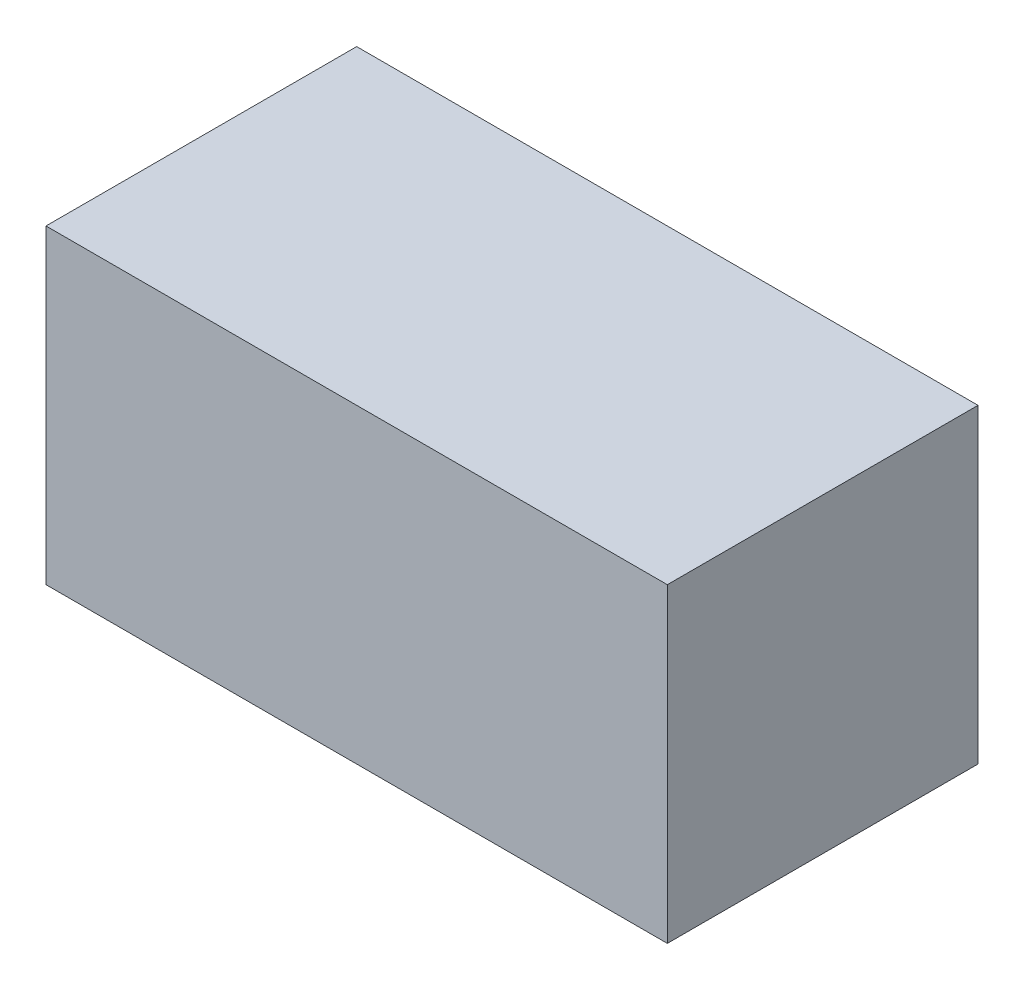
ISO-10303-21;
HEADER;
FILE_DESCRIPTION(('STEP AP214'),'2;1');
FILE_NAME('part.step','',(''),(''),'','','');
FILE_SCHEMA(('AUTOMOTIVE_DESIGN { 1 0 10303 214 1 1 1 1 }'));
ENDSEC;
DATA;
#1=APPLICATION_CONTEXT('core data for automotive mechanical design processes');
#2=APPLICATION_PROTOCOL_DEFINITION('international standard','automotive_design',2000,#1);
#3=PRODUCT_CONTEXT('',#1,'mechanical');
#4=PRODUCT('Part','Part','',(#3));
#5=PRODUCT_RELATED_PRODUCT_CATEGORY('part','',(#4));
#6=PRODUCT_DEFINITION_FORMATION('','',#4);
#7=PRODUCT_DEFINITION_CONTEXT('part definition',#1,'design');
#8=PRODUCT_DEFINITION('design','',#6,#7);
#9=PRODUCT_DEFINITION_SHAPE('','',#8);
#10=(LENGTH_UNIT() NAMED_UNIT(*) SI_UNIT(.MILLI.,.METRE.));
#11=(NAMED_UNIT(*) PLANE_ANGLE_UNIT() SI_UNIT($,.RADIAN.));
#12=(NAMED_UNIT(*) SI_UNIT($,.STERADIAN.) SOLID_ANGLE_UNIT());
#13=UNCERTAINTY_MEASURE_WITH_UNIT(LENGTH_MEASURE(1.E-05),#10,'distance_accuracy_value','');
#14=(GEOMETRIC_REPRESENTATION_CONTEXT(3) GLOBAL_UNCERTAINTY_ASSIGNED_CONTEXT((#13)) GLOBAL_UNIT_ASSIGNED_CONTEXT((#10,
#11,#12)) REPRESENTATION_CONTEXT('',''));
#15=CARTESIAN_POINT('',(0.,0.,0.));
#16=DIRECTION('',(0.,0.,1.));
#17=DIRECTION('',(1.,0.,0.));
#18=AXIS2_PLACEMENT_3D('',#15,#16,#17);
#19=CARTESIAN_POINT('',(0.,0.,15.));
#20=DIRECTION('',(1.,0.,0.));
#21=DIRECTION('',(0.,0.,-1.));
#22=AXIS2_PLACEMENT_3D('',#19,#20,#21);
#23=PLANE('',#22);
#24=DIRECTION('',(0.,-1.,0.));
#25=VECTOR('',#24,1.);
#26=CARTESIAN_POINT('',(0.,0.,5.));
#27=LINE('',#26,#25);
#28=CARTESIAN_POINT('',(0.,10.,5.));
#29=VERTEX_POINT('',#28);
#30=CARTESIAN_POINT('',(0.,0.,5.));
#31=VERTEX_POINT('',#30);
#32=EDGE_CURVE('E96',#29,#31,#27,.T.);
#33=ORIENTED_EDGE('',*,*,#32,.T.);
#34=DIRECTION('',(0.,0.,-1.));
#35=VECTOR('',#34,1.);
#36=CARTESIAN_POINT('',(0.,0.,15.));
#37=LINE('',#36,#35);
#38=CARTESIAN_POINT('',(0.,0.,15.));
#39=VERTEX_POINT('',#38);
#40=EDGE_CURVE('E11',#39,#31,#37,.T.);
#41=ORIENTED_EDGE('',*,*,#40,.F.);
#42=DIRECTION('',(0.,-1.,0.));
#43=VECTOR('',#42,1.);
#44=CARTESIAN_POINT('',(0.,0.,15.));
#45=LINE('',#44,#43);
#46=CARTESIAN_POINT('',(0.,10.,15.));
#47=VERTEX_POINT('',#46);
#48=EDGE_CURVE('E84',#47,#39,#45,.T.);
#49=ORIENTED_EDGE('',*,*,#48,.F.);
#50=DIRECTION('',(0.,0.,-1.));
#51=VECTOR('',#50,1.);
#52=CARTESIAN_POINT('',(0.,10.,15.));
#53=LINE('',#52,#51);
#54=EDGE_CURVE('E92',#47,#29,#53,.T.);
#55=ORIENTED_EDGE('',*,*,#54,.T.);
#56=EDGE_LOOP('',(#33,#41,#49,#55));
#57=FACE_BOUND('',#56,.T.);
#58=ADVANCED_FACE('F33',(#57),#23,.F.);
#59=CARTESIAN_POINT('',(0.,0.,15.));
#60=DIRECTION('',(0.,1.,0.));
#61=DIRECTION('',(0.,0.,1.));
#62=AXIS2_PLACEMENT_3D('',#59,#60,#61);
#63=PLANE('',#62);
#64=DIRECTION('',(1.,0.,0.));
#65=VECTOR('',#64,1.);
#66=CARTESIAN_POINT('',(0.,0.,5.));
#67=LINE('',#66,#65);
#68=CARTESIAN_POINT('',(20.,0.,5.));
#69=VERTEX_POINT('',#68);
#70=EDGE_CURVE('E88',#31,#69,#67,.T.);
#71=ORIENTED_EDGE('',*,*,#70,.T.);
#72=DIRECTION('',(0.,0.,-1.));
#73=VECTOR('',#72,1.);
#74=CARTESIAN_POINT('',(20.,0.,15.));
#75=LINE('',#74,#73);
#76=CARTESIAN_POINT('',(20.,0.,15.));
#77=VERTEX_POINT('',#76);
#78=EDGE_CURVE('E41',#77,#69,#75,.T.);
#79=ORIENTED_EDGE('',*,*,#78,.F.);
#80=DIRECTION('',(1.,0.,0.));
#81=VECTOR('',#80,1.);
#82=CARTESIAN_POINT('',(0.,0.,15.));
#83=LINE('',#82,#81);
#84=EDGE_CURVE('E79',#39,#77,#83,.T.);
#85=ORIENTED_EDGE('',*,*,#84,.F.);
#86=ORIENTED_EDGE('',*,*,#40,.T.);
#87=EDGE_LOOP('',(#71,#79,#85,#86));
#88=FACE_BOUND('',#87,.T.);
#89=ADVANCED_FACE('F87',(#88),#63,.F.);
#90=CARTESIAN_POINT('',(20.,0.,15.));
#91=DIRECTION('',(-1.,0.,0.));
#92=DIRECTION('',(0.,0.,1.));
#93=AXIS2_PLACEMENT_3D('',#90,#91,#92);
#94=PLANE('',#93);
#95=DIRECTION('',(0.,1.,0.));
#96=VECTOR('',#95,1.);
#97=CARTESIAN_POINT('',(20.,0.,5.));
#98=LINE('',#97,#96);
#99=CARTESIAN_POINT('',(20.,10.,5.));
#100=VERTEX_POINT('',#99);
#101=EDGE_CURVE('E66',#69,#100,#98,.T.);
#102=ORIENTED_EDGE('',*,*,#101,.T.);
#103=DIRECTION('',(0.,0.,-1.));
#104=VECTOR('',#103,1.);
#105=CARTESIAN_POINT('',(20.,10.,15.));
#106=LINE('',#105,#104);
#107=CARTESIAN_POINT('',(20.,10.,15.));
#108=VERTEX_POINT('',#107);
#109=EDGE_CURVE('E89',#108,#100,#106,.T.);
#110=ORIENTED_EDGE('',*,*,#109,.F.);
#111=DIRECTION('',(0.,1.,0.));
#112=VECTOR('',#111,1.);
#113=CARTESIAN_POINT('',(20.,0.,15.));
#114=LINE('',#113,#112);
#115=EDGE_CURVE('E82',#77,#108,#114,.T.);
#116=ORIENTED_EDGE('',*,*,#115,.F.);
#117=ORIENTED_EDGE('',*,*,#78,.T.);
#118=EDGE_LOOP('',(#102,#110,#116,#117));
#119=FACE_BOUND('',#118,.T.);
#120=ADVANCED_FACE('F90',(#119),#94,.F.);
#121=CARTESIAN_POINT('',(0.,10.,15.));
#122=DIRECTION('',(0.,-1.,0.));
#123=DIRECTION('',(0.,0.,-1.));
#124=AXIS2_PLACEMENT_3D('',#121,#122,#123);
#125=PLANE('',#124);
#126=DIRECTION('',(-1.,0.,0.));
#127=VECTOR('',#126,1.);
#128=CARTESIAN_POINT('',(0.,10.,5.));
#129=LINE('',#128,#127);
#130=EDGE_CURVE('E72',#100,#29,#129,.T.);
#131=ORIENTED_EDGE('',*,*,#130,.T.);
#132=ORIENTED_EDGE('',*,*,#54,.F.);
#133=DIRECTION('',(-1.,0.,0.));
#134=VECTOR('',#133,1.);
#135=CARTESIAN_POINT('',(0.,10.,15.));
#136=LINE('',#135,#134);
#137=EDGE_CURVE('E49',#108,#47,#136,.T.);
#138=ORIENTED_EDGE('',*,*,#137,.F.);
#139=ORIENTED_EDGE('',*,*,#109,.T.);
#140=EDGE_LOOP('',(#131,#132,#138,#139));
#141=FACE_BOUND('',#140,.T.);
#142=ADVANCED_FACE('F103',(#141),#125,.F.);
#143=CARTESIAN_POINT('',(0.,0.,15.));
#144=DIRECTION('',(0.,0.,-1.));
#145=DIRECTION('',(-1.,0.,0.));
#146=AXIS2_PLACEMENT_3D('',#143,#144,#145);
#147=PLANE('',#146);
#148=ORIENTED_EDGE('',*,*,#48,.T.);
#149=ORIENTED_EDGE('',*,*,#84,.T.);
#150=ORIENTED_EDGE('',*,*,#115,.T.);
#151=ORIENTED_EDGE('',*,*,#137,.T.);
#152=EDGE_LOOP('',(#148,#149,#150,#151));
#153=FACE_BOUND('',#152,.T.);
#154=ADVANCED_FACE('F80',(#153),#147,.F.);
#155=CARTESIAN_POINT('',(0.,0.,5.));
#156=DIRECTION('',(0.,0.,-1.));
#157=DIRECTION('',(-1.,0.,0.));
#158=AXIS2_PLACEMENT_3D('',#155,#156,#157);
#159=PLANE('',#158);
#160=ORIENTED_EDGE('',*,*,#32,.F.);
#161=ORIENTED_EDGE('',*,*,#130,.F.);
#162=ORIENTED_EDGE('',*,*,#101,.F.);
#163=ORIENTED_EDGE('',*,*,#70,.F.);
#164=EDGE_LOOP('',(#160,#161,#162,#163));
#165=FACE_BOUND('',#164,.T.);
#166=ADVANCED_FACE('F106',(#165),#159,.T.);
#167=CLOSED_SHELL('',(#58,#89,#120,#142,#154,#166));
#168=MANIFOLD_SOLID_BREP('B2',#167);
#169=ADVANCED_BREP_SHAPE_REPRESENTATION('',(#18,#168),#14);
#170=SHAPE_DEFINITION_REPRESENTATION(#9,#169);
ENDSEC;
END-ISO-10303-21;
